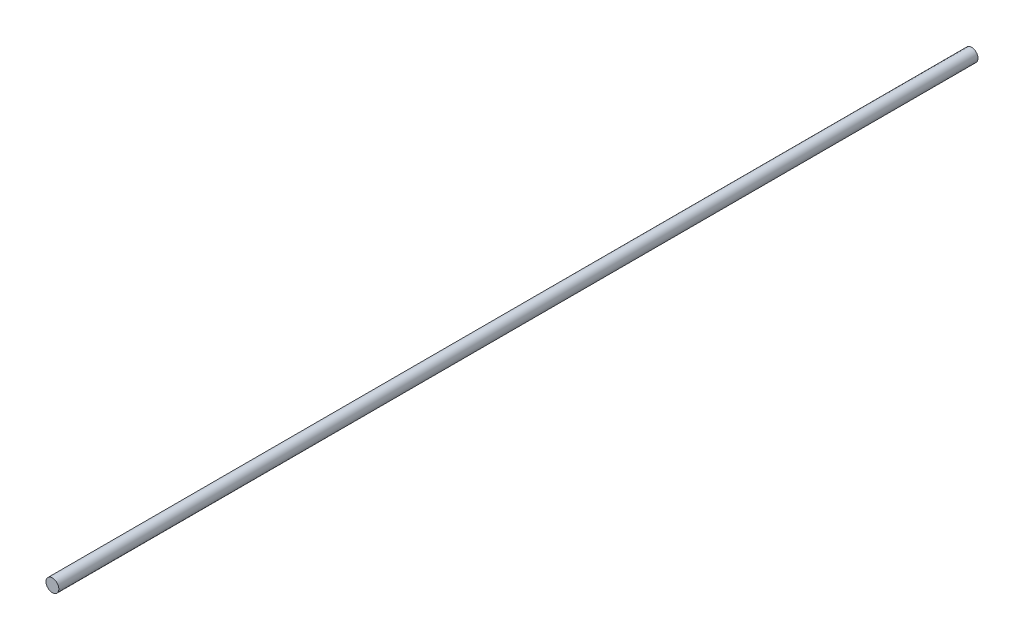
ISO-10303-21;
HEADER;
FILE_DESCRIPTION(('STEP AP214'),'2;1');
FILE_NAME('part.step','',(''),(''),'','','');
FILE_SCHEMA(('AUTOMOTIVE_DESIGN { 1 0 10303 214 1 1 1 1 }'));
ENDSEC;
DATA;
#1=APPLICATION_CONTEXT('core data for automotive mechanical design processes');
#2=APPLICATION_PROTOCOL_DEFINITION('international standard','automotive_design',2000,#1);
#3=PRODUCT_CONTEXT('',#1,'mechanical');
#4=PRODUCT('Part','Part','',(#3));
#5=PRODUCT_RELATED_PRODUCT_CATEGORY('part','',(#4));
#6=PRODUCT_DEFINITION_FORMATION('','',#4);
#7=PRODUCT_DEFINITION_CONTEXT('part definition',#1,'design');
#8=PRODUCT_DEFINITION('design','',#6,#7);
#9=PRODUCT_DEFINITION_SHAPE('','',#8);
#10=(LENGTH_UNIT() NAMED_UNIT(*) SI_UNIT(.MILLI.,.METRE.));
#11=(NAMED_UNIT(*) PLANE_ANGLE_UNIT() SI_UNIT($,.RADIAN.));
#12=(NAMED_UNIT(*) SI_UNIT($,.STERADIAN.) SOLID_ANGLE_UNIT());
#13=UNCERTAINTY_MEASURE_WITH_UNIT(LENGTH_MEASURE(1.E-05),#10,'distance_accuracy_value','');
#14=(GEOMETRIC_REPRESENTATION_CONTEXT(3) GLOBAL_UNCERTAINTY_ASSIGNED_CONTEXT((#13)) GLOBAL_UNIT_ASSIGNED_CONTEXT((#10,
#11,#12)) REPRESENTATION_CONTEXT('',''));
#15=CARTESIAN_POINT('',(0.,0.,0.));
#16=DIRECTION('',(0.,0.,1.));
#17=DIRECTION('',(1.,0.,0.));
#18=AXIS2_PLACEMENT_3D('',#15,#16,#17);
#19=CARTESIAN_POINT('',(-2.99287927969726,0.051942023128104,215.));
#20=DIRECTION('',(0.,0.,-1.));
#21=DIRECTION('',(-1.,0.,0.));
#22=AXIS2_PLACEMENT_3D('',#19,#20,#21);
#23=CYLINDRICAL_SURFACE('',#22,1.5);
#24=CARTESIAN_POINT('',(-2.99287927969726,0.051942023128104,215.));
#25=DIRECTION('',(0.,0.,1.));
#26=DIRECTION('',(1.,0.,0.));
#27=AXIS2_PLACEMENT_3D('',#24,#25,#26);
#28=CIRCLE('',#27,1.5);
#29=CARTESIAN_POINT('',(-1.49287927969726,0.051942023128104,215.));
#30=VERTEX_POINT('',#29);
#31=EDGE_CURVE('E10',#30,#30,#28,.T.);
#32=ORIENTED_EDGE('',*,*,#31,.F.);
#33=EDGE_LOOP('',(#32));
#34=FACE_BOUND('',#33,.T.);
#35=CARTESIAN_POINT('',(-2.99287927969726,0.051942023128104,0.));
#36=DIRECTION('',(0.,0.,1.));
#37=DIRECTION('',(1.,0.,0.));
#38=AXIS2_PLACEMENT_3D('',#35,#36,#37);
#39=CIRCLE('',#38,1.5);
#40=CARTESIAN_POINT('',(-1.49287927969726,0.051942023128104,0.));
#41=VERTEX_POINT('',#40);
#42=EDGE_CURVE('E44',#41,#41,#39,.T.);
#43=ORIENTED_EDGE('',*,*,#42,.T.);
#44=EDGE_LOOP('',(#43));
#45=FACE_BOUND('',#44,.T.);
#46=ADVANCED_FACE('F41',(#34,#45),#23,.T.);
#47=CARTESIAN_POINT('',(-2.99287927969726,0.051942023128104,215.));
#48=DIRECTION('',(0.,0.,1.));
#49=DIRECTION('',(1.,0.,0.));
#50=AXIS2_PLACEMENT_3D('',#47,#48,#49);
#51=PLANE('',#50);
#52=ORIENTED_EDGE('',*,*,#31,.T.);
#53=EDGE_LOOP('',(#52));
#54=FACE_BOUND('',#53,.T.);
#55=ADVANCED_FACE('F58',(#54),#51,.T.);
#56=CARTESIAN_POINT('',(-2.99287927969726,0.051942023128104,0.));
#57=DIRECTION('',(0.,0.,1.));
#58=DIRECTION('',(1.,0.,0.));
#59=AXIS2_PLACEMENT_3D('',#56,#57,#58);
#60=PLANE('',#59);
#61=ORIENTED_EDGE('',*,*,#42,.F.);
#62=EDGE_LOOP('',(#61));
#63=FACE_BOUND('',#62,.T.);
#64=ADVANCED_FACE('F56',(#63),#60,.F.);
#65=CLOSED_SHELL('',(#46,#55,#64));
#66=MANIFOLD_SOLID_BREP('B2',#65);
#67=ADVANCED_BREP_SHAPE_REPRESENTATION('',(#18,#66),#14);
#68=SHAPE_DEFINITION_REPRESENTATION(#9,#67);
ENDSEC;
END-ISO-10303-21;
